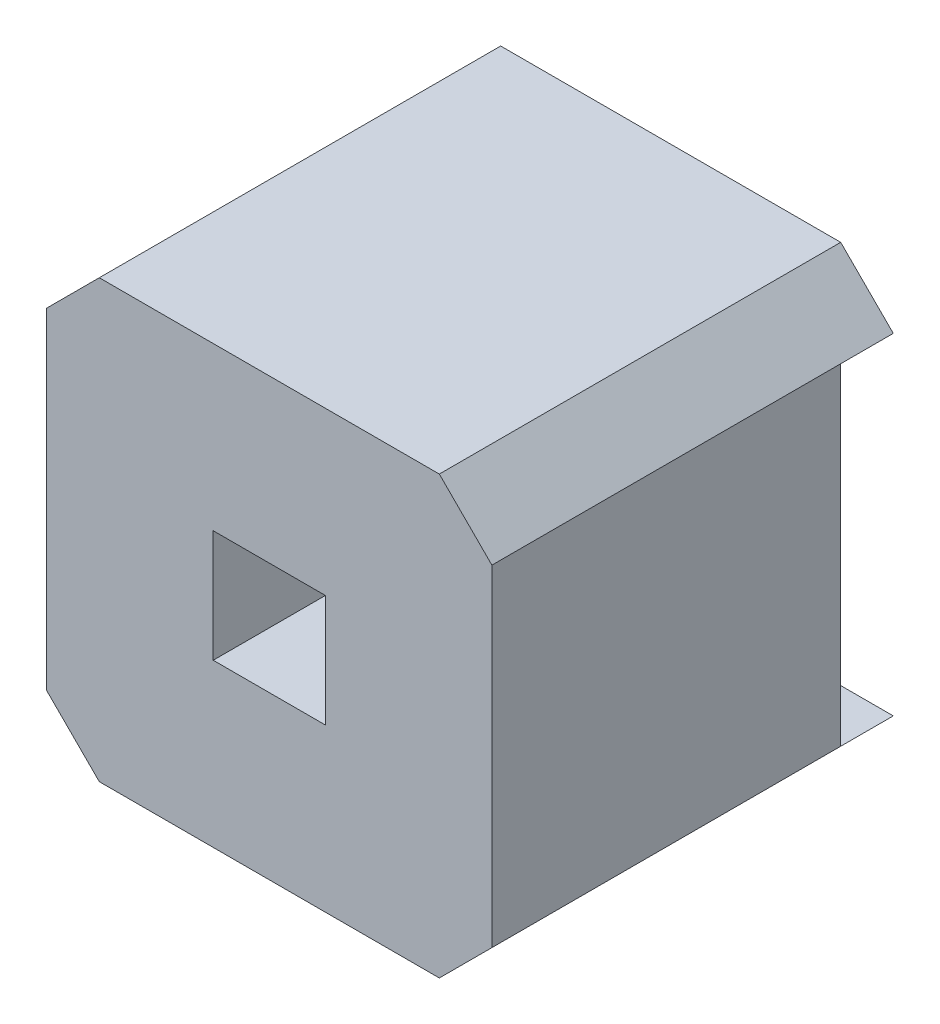
ISO-10303-21;
HEADER;
FILE_DESCRIPTION(('STEP AP214'),'2;1');
FILE_NAME('part.step','',(''),(''),'','','');
FILE_SCHEMA(('AUTOMOTIVE_DESIGN { 1 0 10303 214 1 1 1 1 }'));
ENDSEC;
DATA;
#1=APPLICATION_CONTEXT('core data for automotive mechanical design processes');
#2=APPLICATION_PROTOCOL_DEFINITION('international standard','automotive_design',2000,#1);
#3=PRODUCT_CONTEXT('',#1,'mechanical');
#4=PRODUCT('Part','Part','',(#3));
#5=PRODUCT_RELATED_PRODUCT_CATEGORY('part','',(#4));
#6=PRODUCT_DEFINITION_FORMATION('','',#4);
#7=PRODUCT_DEFINITION_CONTEXT('part definition',#1,'design');
#8=PRODUCT_DEFINITION('design','',#6,#7);
#9=PRODUCT_DEFINITION_SHAPE('','',#8);
#10=(LENGTH_UNIT() NAMED_UNIT(*) SI_UNIT(.MILLI.,.METRE.));
#11=(NAMED_UNIT(*) PLANE_ANGLE_UNIT() SI_UNIT($,.RADIAN.));
#12=(NAMED_UNIT(*) SI_UNIT($,.STERADIAN.) SOLID_ANGLE_UNIT());
#13=UNCERTAINTY_MEASURE_WITH_UNIT(LENGTH_MEASURE(1.E-05),#10,'distance_accuracy_value','');
#14=(GEOMETRIC_REPRESENTATION_CONTEXT(3) GLOBAL_UNCERTAINTY_ASSIGNED_CONTEXT((#13)) GLOBAL_UNIT_ASSIGNED_CONTEXT((#10,
#11,#12)) REPRESENTATION_CONTEXT('',''));
#15=CARTESIAN_POINT('',(0.,0.,0.));
#16=DIRECTION('',(0.,0.,1.));
#17=DIRECTION('',(1.,0.,0.));
#18=AXIS2_PLACEMENT_3D('',#15,#16,#17);
#19=CARTESIAN_POINT('',(6.349999885559,1.245,2.289999961853));
#20=DIRECTION('',(0.,0.,1.));
#21=DIRECTION('',(1.,0.,0.));
#22=AXIS2_PLACEMENT_3D('',#19,#20,#21);
#23=PLANE('',#22);
#24=DIRECTION('',(0.,1.,0.));
#25=VECTOR('',#24,1.);
#26=CARTESIAN_POINT('',(7.939999885559,0.32,2.289999961853));
#27=LINE('',#26,#25);
#28=CARTESIAN_POINT('',(7.939999885559,-0.32,2.289999961853));
#29=VERTEX_POINT('',#28);
#30=CARTESIAN_POINT('',(7.939999885559,0.32,2.289999961853));
#31=VERTEX_POINT('',#30);
#32=EDGE_CURVE('E11',#29,#31,#27,.T.);
#33=ORIENTED_EDGE('',*,*,#32,.F.);
#34=DIRECTION('',(-1.,0.,0.));
#35=VECTOR('',#34,1.);
#36=CARTESIAN_POINT('',(6.349999885559,-0.32,2.289999961853));
#37=LINE('',#36,#35);
#38=CARTESIAN_POINT('',(7.299999885559,-0.32,2.289999961853));
#39=VERTEX_POINT('',#38);
#40=EDGE_CURVE('E24',#29,#39,#37,.T.);
#41=ORIENTED_EDGE('',*,*,#40,.T.);
#42=DIRECTION('',(0.,-1.,0.));
#43=VECTOR('',#42,1.);
#44=CARTESIAN_POINT('',(7.299999885559,-0.32,2.289999961853));
#45=LINE('',#44,#43);
#46=CARTESIAN_POINT('',(7.299999885559,0.32,2.289999961853));
#47=VERTEX_POINT('',#46);
#48=EDGE_CURVE('E231',#47,#39,#45,.T.);
#49=ORIENTED_EDGE('',*,*,#48,.F.);
#50=DIRECTION('',(-1.,0.,0.));
#51=VECTOR('',#50,1.);
#52=CARTESIAN_POINT('',(7.299999885559,0.32,2.289999961853));
#53=LINE('',#52,#51);
#54=EDGE_CURVE('E228',#31,#47,#53,.T.);
#55=ORIENTED_EDGE('',*,*,#54,.F.);
#56=EDGE_LOOP('',(#33,#41,#49,#55));
#57=FACE_BOUND('',#56,.T.);
#58=DIRECTION('',(0.,1.,0.));
#59=VECTOR('',#58,1.);
#60=CARTESIAN_POINT('',(8.889999885559,1.245,2.289999961853));
#61=LINE('',#60,#59);
#62=CARTESIAN_POINT('',(8.88999988555925,-0.94499998807925,2.289999961853));
#63=VERTEX_POINT('',#62);
#64=CARTESIAN_POINT('',(8.88999988555925,0.94499998807925,2.289999961853));
#65=VERTEX_POINT('',#64);
#66=EDGE_CURVE('E226',#63,#65,#61,.T.);
#67=ORIENTED_EDGE('',*,*,#66,.T.);
#68=DIRECTION('',(0.707106781186548,-0.707106781186548,0.));
#69=VECTOR('',#68,1.);
#70=CARTESIAN_POINT('',(8.739999879599,1.09499999404,2.289999961853));
#71=LINE('',#70,#69);
#72=CARTESIAN_POINT('',(8.58999987363825,1.24500000000025,2.289999961853));
#73=VERTEX_POINT('',#72);
#74=EDGE_CURVE('E223',#73,#65,#71,.T.);
#75=ORIENTED_EDGE('',*,*,#74,.F.);
#76=DIRECTION('',(-1.,0.,0.));
#77=VECTOR('',#76,1.);
#78=CARTESIAN_POINT('',(6.349999885559,1.245,2.289999961853));
#79=LINE('',#78,#77);
#80=CARTESIAN_POINT('',(6.64999989748,1.245,2.289999961853));
#81=VERTEX_POINT('',#80);
#82=EDGE_CURVE('E221',#73,#81,#79,.T.);
#83=ORIENTED_EDGE('',*,*,#82,.T.);
#84=DIRECTION('',(0.707106781186548,0.707106781186548,0.));
#85=VECTOR('',#84,1.);
#86=CARTESIAN_POINT('',(6.49999989152,1.09499999404,2.289999961853));
#87=LINE('',#86,#85);
#88=CARTESIAN_POINT('',(6.349999885559,0.944999988079,2.289999961853));
#89=VERTEX_POINT('',#88);
#90=EDGE_CURVE('E219',#89,#81,#87,.T.);
#91=ORIENTED_EDGE('',*,*,#90,.F.);
#92=DIRECTION('',(0.,-1.,0.));
#93=VECTOR('',#92,1.);
#94=CARTESIAN_POINT('',(6.349999885559,1.245,2.289999961853));
#95=LINE('',#94,#93);
#96=CARTESIAN_POINT('',(6.349999885559,-0.944999988079,2.289999961853));
#97=VERTEX_POINT('',#96);
#98=EDGE_CURVE('E217',#89,#97,#95,.T.);
#99=ORIENTED_EDGE('',*,*,#98,.T.);
#100=DIRECTION('',(-0.707106781186548,0.707106781186548,0.));
#101=VECTOR('',#100,1.);
#102=CARTESIAN_POINT('',(6.49999989152,-1.09499999404,2.289999961853));
#103=LINE('',#102,#101);
#104=CARTESIAN_POINT('',(6.64999989748,-1.245,2.289999961853));
#105=VERTEX_POINT('',#104);
#106=EDGE_CURVE('E214',#105,#97,#103,.T.);
#107=ORIENTED_EDGE('',*,*,#106,.F.);
#108=DIRECTION('',(1.,0.,0.));
#109=VECTOR('',#108,1.);
#110=CARTESIAN_POINT('',(6.349999885559,-1.245,2.289999961853));
#111=LINE('',#110,#109);
#112=CARTESIAN_POINT('',(8.58999987363825,-1.24500000000025,2.289999961853));
#113=VERTEX_POINT('',#112);
#114=EDGE_CURVE('E212',#105,#113,#111,.T.);
#115=ORIENTED_EDGE('',*,*,#114,.T.);
#116=DIRECTION('',(-0.707106781186548,-0.707106781186548,0.));
#117=VECTOR('',#116,1.);
#118=CARTESIAN_POINT('',(8.739999879599,-1.09499999404,2.289999961853));
#119=LINE('',#118,#117);
#120=EDGE_CURVE('E209',#63,#113,#119,.T.);
#121=ORIENTED_EDGE('',*,*,#120,.F.);
#122=EDGE_LOOP('',(#67,#75,#83,#91,#99,#107,#115,#121));
#123=FACE_BOUND('',#122,.T.);
#124=ADVANCED_FACE('F17',(#57,#123),#23,.T.);
#125=CARTESIAN_POINT('',(7.939999885559,-0.32,2.289999961853));
#126=DIRECTION('',(0.,1.,0.));
#127=DIRECTION('',(0.,0.,1.));
#128=AXIS2_PLACEMENT_3D('',#125,#126,#127);
#129=PLANE('',#128);
#130=DIRECTION('',(0.,0.,1.));
#131=VECTOR('',#130,1.);
#132=CARTESIAN_POINT('',(7.299999885559,-0.32,2.289999961853));
#133=LINE('',#132,#131);
#134=CARTESIAN_POINT('',(7.299999885559,-0.32,0.300000011921));
#135=VERTEX_POINT('',#134);
#136=EDGE_CURVE('E206',#135,#39,#133,.T.);
#137=ORIENTED_EDGE('',*,*,#136,.T.);
#138=ORIENTED_EDGE('',*,*,#40,.F.);
#139=DIRECTION('',(0.,0.,-1.));
#140=VECTOR('',#139,1.);
#141=CARTESIAN_POINT('',(7.939999885559,-0.32,2.289999961853));
#142=LINE('',#141,#140);
#143=CARTESIAN_POINT('',(7.939999885559,-0.32,0.300000011921));
#144=VERTEX_POINT('',#143);
#145=EDGE_CURVE('E204',#29,#144,#142,.T.);
#146=ORIENTED_EDGE('',*,*,#145,.T.);
#147=DIRECTION('',(-1.,0.,0.));
#148=VECTOR('',#147,1.);
#149=CARTESIAN_POINT('',(7.939999885559,-0.32,0.300000011921));
#150=LINE('',#149,#148);
#151=EDGE_CURVE('E201',#144,#135,#150,.T.);
#152=ORIENTED_EDGE('',*,*,#151,.T.);
#153=EDGE_LOOP('',(#137,#138,#146,#152));
#154=FACE_BOUND('',#153,.T.);
#155=ADVANCED_FACE('F237',(#154),#129,.T.);
#156=CARTESIAN_POINT('',(8.889999885559,1.245,0.));
#157=DIRECTION('',(1.,0.,0.));
#158=DIRECTION('',(0.,0.,-1.));
#159=AXIS2_PLACEMENT_3D('',#156,#157,#158);
#160=PLANE('',#159);
#161=ORIENTED_EDGE('',*,*,#66,.F.);
#162=DIRECTION('',(0.,0.,-1.));
#163=VECTOR('',#162,1.);
#164=CARTESIAN_POINT('',(8.889999885559,-0.944999988079,0.));
#165=LINE('',#164,#163);
#166=CARTESIAN_POINT('',(8.88999988555906,-0.944999988079063,0.300000011921));
#167=VERTEX_POINT('',#166);
#168=EDGE_CURVE('E199',#63,#167,#165,.T.);
#169=ORIENTED_EDGE('',*,*,#168,.T.);
#170=DIRECTION('',(0.,1.,0.));
#171=VECTOR('',#170,1.);
#172=CARTESIAN_POINT('',(8.889999885559,1.245,0.300000011921));
#173=LINE('',#172,#171);
#174=CARTESIAN_POINT('',(8.88999988555906,0.944999988079063,0.300000011921));
#175=VERTEX_POINT('',#174);
#176=EDGE_CURVE('E197',#167,#175,#173,.T.);
#177=ORIENTED_EDGE('',*,*,#176,.T.);
#178=DIRECTION('',(0.,0.,1.));
#179=VECTOR('',#178,1.);
#180=CARTESIAN_POINT('',(8.889999885559,0.944999988079,0.));
#181=LINE('',#180,#179);
#182=EDGE_CURVE('E194',#175,#65,#181,.T.);
#183=ORIENTED_EDGE('',*,*,#182,.T.);
#184=EDGE_LOOP('',(#161,#169,#177,#183));
#185=FACE_BOUND('',#184,.T.);
#186=ADVANCED_FACE('F265',(#185),#160,.T.);
#187=CARTESIAN_POINT('',(8.889999885559,-1.245,0.));
#188=DIRECTION('',(0.,-1.,0.));
#189=DIRECTION('',(0.,0.,-1.));
#190=AXIS2_PLACEMENT_3D('',#187,#188,#189);
#191=PLANE('',#190);
#192=ORIENTED_EDGE('',*,*,#114,.F.);
#193=DIRECTION('',(0.,0.,-1.));
#194=VECTOR('',#193,1.);
#195=CARTESIAN_POINT('',(6.64999989748,-1.245,0.));
#196=LINE('',#195,#194);
#197=CARTESIAN_POINT('',(6.64999989748,-1.245,0.));
#198=VERTEX_POINT('',#197);
#199=EDGE_CURVE('E192',#105,#198,#196,.T.);
#200=ORIENTED_EDGE('',*,*,#199,.T.);
#201=DIRECTION('',(1.,0.,0.));
#202=VECTOR('',#201,1.);
#203=CARTESIAN_POINT('',(8.889999885559,-1.245,0.));
#204=LINE('',#203,#202);
#205=CARTESIAN_POINT('',(8.58999987363812,-1.24500000000012,0.));
#206=VERTEX_POINT('',#205);
#207=EDGE_CURVE('E190',#198,#206,#204,.T.);
#208=ORIENTED_EDGE('',*,*,#207,.T.);
#209=DIRECTION('',(0.,0.,1.));
#210=VECTOR('',#209,1.);
#211=CARTESIAN_POINT('',(8.589999873638,-1.245,0.));
#212=LINE('',#211,#210);
#213=EDGE_CURVE('E187',#206,#113,#212,.T.);
#214=ORIENTED_EDGE('',*,*,#213,.T.);
#215=EDGE_LOOP('',(#192,#200,#208,#214));
#216=FACE_BOUND('',#215,.T.);
#217=ADVANCED_FACE('F269',(#216),#191,.T.);
#218=CARTESIAN_POINT('',(6.349999885559,-1.245,0.));
#219=DIRECTION('',(-1.,0.,0.));
#220=DIRECTION('',(0.,0.,1.));
#221=AXIS2_PLACEMENT_3D('',#218,#219,#220);
#222=PLANE('',#221);
#223=ORIENTED_EDGE('',*,*,#98,.F.);
#224=DIRECTION('',(0.,0.,-1.));
#225=VECTOR('',#224,1.);
#226=CARTESIAN_POINT('',(6.349999885559,0.944999988079,0.));
#227=LINE('',#226,#225);
#228=CARTESIAN_POINT('',(6.349999885559,0.944999988079,0.300000011921));
#229=VERTEX_POINT('',#228);
#230=EDGE_CURVE('E185',#89,#229,#227,.T.);
#231=ORIENTED_EDGE('',*,*,#230,.T.);
#232=DIRECTION('',(0.,-1.,0.));
#233=VECTOR('',#232,1.);
#234=CARTESIAN_POINT('',(6.349999885559,-1.245,0.300000011921));
#235=LINE('',#234,#233);
#236=CARTESIAN_POINT('',(6.349999885559,-0.944999988079,0.300000011921));
#237=VERTEX_POINT('',#236);
#238=EDGE_CURVE('E183',#229,#237,#235,.T.);
#239=ORIENTED_EDGE('',*,*,#238,.T.);
#240=DIRECTION('',(0.,0.,1.));
#241=VECTOR('',#240,1.);
#242=CARTESIAN_POINT('',(6.349999885559,-0.944999988079,0.));
#243=LINE('',#242,#241);
#244=EDGE_CURVE('E180',#237,#97,#243,.T.);
#245=ORIENTED_EDGE('',*,*,#244,.T.);
#246=EDGE_LOOP('',(#223,#231,#239,#245));
#247=FACE_BOUND('',#246,.T.);
#248=ADVANCED_FACE('F275',(#247),#222,.T.);
#249=CARTESIAN_POINT('',(6.349999885559,1.245,0.));
#250=DIRECTION('',(0.,1.,0.));
#251=DIRECTION('',(0.,0.,1.));
#252=AXIS2_PLACEMENT_3D('',#249,#250,#251);
#253=PLANE('',#252);
#254=ORIENTED_EDGE('',*,*,#82,.F.);
#255=DIRECTION('',(0.,0.,-1.));
#256=VECTOR('',#255,1.);
#257=CARTESIAN_POINT('',(8.589999873638,1.245,0.));
#258=LINE('',#257,#256);
#259=CARTESIAN_POINT('',(8.58999987363812,1.24500000000012,0.));
#260=VERTEX_POINT('',#259);
#261=EDGE_CURVE('E178',#73,#260,#258,.T.);
#262=ORIENTED_EDGE('',*,*,#261,.T.);
#263=DIRECTION('',(-1.,0.,0.));
#264=VECTOR('',#263,1.);
#265=CARTESIAN_POINT('',(6.349999885559,1.245,0.));
#266=LINE('',#265,#264);
#267=CARTESIAN_POINT('',(6.64999989748,1.245,0.));
#268=VERTEX_POINT('',#267);
#269=EDGE_CURVE('E176',#260,#268,#266,.T.);
#270=ORIENTED_EDGE('',*,*,#269,.T.);
#271=DIRECTION('',(0.,0.,1.));
#272=VECTOR('',#271,1.);
#273=CARTESIAN_POINT('',(6.64999989748,1.245,0.));
#274=LINE('',#273,#272);
#275=EDGE_CURVE('E122',#268,#81,#274,.T.);
#276=ORIENTED_EDGE('',*,*,#275,.T.);
#277=EDGE_LOOP('',(#254,#262,#270,#276));
#278=FACE_BOUND('',#277,.T.);
#279=ADVANCED_FACE('F279',(#278),#253,.T.);
#280=CARTESIAN_POINT('',(7.299999885559,-0.32,2.289999961853));
#281=DIRECTION('',(1.,0.,0.));
#282=DIRECTION('',(0.,0.,-1.));
#283=AXIS2_PLACEMENT_3D('',#280,#281,#282);
#284=PLANE('',#283);
#285=DIRECTION('',(0.,0.,1.));
#286=VECTOR('',#285,1.);
#287=CARTESIAN_POINT('',(7.299999885559,0.32,2.289999961853));
#288=LINE('',#287,#286);
#289=CARTESIAN_POINT('',(7.299999885559,0.32,0.300000011921));
#290=VERTEX_POINT('',#289);
#291=EDGE_CURVE('E172',#290,#47,#288,.T.);
#292=ORIENTED_EDGE('',*,*,#291,.T.);
#293=ORIENTED_EDGE('',*,*,#48,.T.);
#294=ORIENTED_EDGE('',*,*,#136,.F.);
#295=DIRECTION('',(0.,1.,0.));
#296=VECTOR('',#295,1.);
#297=CARTESIAN_POINT('',(7.299999885559,-0.32,0.300000011921));
#298=LINE('',#297,#296);
#299=EDGE_CURVE('E169',#135,#290,#298,.T.);
#300=ORIENTED_EDGE('',*,*,#299,.T.);
#301=EDGE_LOOP('',(#292,#293,#294,#300));
#302=FACE_BOUND('',#301,.T.);
#303=ADVANCED_FACE('F236',(#302),#284,.T.);
#304=CARTESIAN_POINT('',(6.349999885559,-0.944999988079,0.300000011921));
#305=DIRECTION('',(0.,0.,-1.));
#306=DIRECTION('',(-1.,0.,0.));
#307=AXIS2_PLACEMENT_3D('',#304,#305,#306);
#308=PLANE('',#307);
#309=DIRECTION('',(1.,0.,0.));
#310=VECTOR('',#309,1.);
#311=CARTESIAN_POINT('',(6.349999885559,0.944999988079,0.300000011921));
#312=LINE('',#311,#310);
#313=EDGE_CURVE('E135',#229,#175,#312,.T.);
#314=ORIENTED_EDGE('',*,*,#313,.T.);
#315=ORIENTED_EDGE('',*,*,#176,.F.);
#316=DIRECTION('',(-1.,0.,0.));
#317=VECTOR('',#316,1.);
#318=CARTESIAN_POINT('',(6.349999885559,-0.944999988079,0.300000011921));
#319=LINE('',#318,#317);
#320=EDGE_CURVE('E165',#167,#237,#319,.T.);
#321=ORIENTED_EDGE('',*,*,#320,.T.);
#322=ORIENTED_EDGE('',*,*,#238,.F.);
#323=EDGE_LOOP('',(#314,#315,#321,#322));
#324=FACE_BOUND('',#323,.T.);
#325=DIRECTION('',(0.,1.,0.));
#326=VECTOR('',#325,1.);
#327=CARTESIAN_POINT('',(7.939999885559,-0.944999988079,0.300000011921));
#328=LINE('',#327,#326);
#329=CARTESIAN_POINT('',(7.939999885559,0.32,0.300000011921));
#330=VERTEX_POINT('',#329);
#331=EDGE_CURVE('E163',#144,#330,#328,.T.);
#332=ORIENTED_EDGE('',*,*,#331,.T.);
#333=DIRECTION('',(-1.,0.,0.));
#334=VECTOR('',#333,1.);
#335=CARTESIAN_POINT('',(6.349999885559,0.32,0.300000011921));
#336=LINE('',#335,#334);
#337=EDGE_CURVE('E160',#330,#290,#336,.T.);
#338=ORIENTED_EDGE('',*,*,#337,.T.);
#339=ORIENTED_EDGE('',*,*,#299,.F.);
#340=ORIENTED_EDGE('',*,*,#151,.F.);
#341=EDGE_LOOP('',(#332,#338,#339,#340));
#342=FACE_BOUND('',#341,.T.);
#343=ADVANCED_FACE('F242',(#324,#342),#308,.T.);
#344=CARTESIAN_POINT('',(7.939999885559,0.32,2.289999961853));
#345=DIRECTION('',(-1.,0.,0.));
#346=DIRECTION('',(0.,0.,1.));
#347=AXIS2_PLACEMENT_3D('',#344,#345,#346);
#348=PLANE('',#347);
#349=ORIENTED_EDGE('',*,*,#145,.F.);
#350=ORIENTED_EDGE('',*,*,#32,.T.);
#351=DIRECTION('',(0.,0.,-1.));
#352=VECTOR('',#351,1.);
#353=CARTESIAN_POINT('',(7.939999885559,0.32,2.289999961853));
#354=LINE('',#353,#352);
#355=EDGE_CURVE('E158',#31,#330,#354,.T.);
#356=ORIENTED_EDGE('',*,*,#355,.T.);
#357=ORIENTED_EDGE('',*,*,#331,.F.);
#358=EDGE_LOOP('',(#349,#350,#356,#357));
#359=FACE_BOUND('',#358,.T.);
#360=ADVANCED_FACE('F247',(#359),#348,.T.);
#361=CARTESIAN_POINT('',(8.739999879599,-1.09499999404,0.));
#362=DIRECTION('',(0.707106781186548,-0.707106781186548,0.));
#363=DIRECTION('',(0.707106781186548,0.707106781186548,0.));
#364=AXIS2_PLACEMENT_3D('',#361,#362,#363);
#365=PLANE('',#364);
#366=ORIENTED_EDGE('',*,*,#120,.T.);
#367=ORIENTED_EDGE('',*,*,#213,.F.);
#368=DIRECTION('',(0.707106781186548,0.707106781186548,0.));
#369=VECTOR('',#368,1.);
#370=CARTESIAN_POINT('',(8.739999879599,-1.09499999404,0.));
#371=LINE('',#370,#369);
#372=CARTESIAN_POINT('',(8.88999988555913,-0.944999988079125,0.));
#373=VERTEX_POINT('',#372);
#374=EDGE_CURVE('E156',#206,#373,#371,.T.);
#375=ORIENTED_EDGE('',*,*,#374,.T.);
#376=DIRECTION('',(0.,0.,1.));
#377=VECTOR('',#376,1.);
#378=CARTESIAN_POINT('',(8.8899998855595,-0.9449999880795,0.));
#379=LINE('',#378,#377);
#380=EDGE_CURVE('E153',#373,#167,#379,.T.);
#381=ORIENTED_EDGE('',*,*,#380,.T.);
#382=ORIENTED_EDGE('',*,*,#168,.F.);
#383=EDGE_LOOP('',(#366,#367,#375,#381,#382));
#384=FACE_BOUND('',#383,.T.);
#385=ADVANCED_FACE('F249',(#384),#365,.T.);
#386=CARTESIAN_POINT('',(8.739999879599,1.09499999404,0.));
#387=DIRECTION('',(0.707106781186548,0.707106781186548,0.));
#388=DIRECTION('',(-0.707106781186548,0.707106781186548,0.));
#389=AXIS2_PLACEMENT_3D('',#386,#387,#388);
#390=PLANE('',#389);
#391=ORIENTED_EDGE('',*,*,#182,.F.);
#392=DIRECTION('',(0.,0.,-1.));
#393=VECTOR('',#392,1.);
#394=CARTESIAN_POINT('',(8.8899998855595,0.9449999880795,0.));
#395=LINE('',#394,#393);
#396=CARTESIAN_POINT('',(8.88999988555913,0.944999988079125,0.));
#397=VERTEX_POINT('',#396);
#398=EDGE_CURVE('E151',#175,#397,#395,.T.);
#399=ORIENTED_EDGE('',*,*,#398,.T.);
#400=DIRECTION('',(-0.707106781186548,0.707106781186548,0.));
#401=VECTOR('',#400,1.);
#402=CARTESIAN_POINT('',(8.739999879599,1.09499999404,0.));
#403=LINE('',#402,#401);
#404=EDGE_CURVE('E140',#397,#260,#403,.T.);
#405=ORIENTED_EDGE('',*,*,#404,.T.);
#406=ORIENTED_EDGE('',*,*,#261,.F.);
#407=ORIENTED_EDGE('',*,*,#74,.T.);
#408=EDGE_LOOP('',(#391,#399,#405,#406,#407));
#409=FACE_BOUND('',#408,.T.);
#410=ADVANCED_FACE('F256',(#409),#390,.T.);
#411=CARTESIAN_POINT('',(6.49999989152,-1.09499999404,0.));
#412=DIRECTION('',(-0.707106781186548,-0.707106781186548,0.));
#413=DIRECTION('',(0.707106781186548,-0.707106781186548,0.));
#414=AXIS2_PLACEMENT_3D('',#411,#412,#413);
#415=PLANE('',#414);
#416=DIRECTION('',(0.,0.,-1.));
#417=VECTOR('',#416,1.);
#418=CARTESIAN_POINT('',(6.349999885559,-0.944999988078999,0.));
#419=LINE('',#418,#417);
#420=CARTESIAN_POINT('',(6.349999885559,-0.944999988079,0.));
#421=VERTEX_POINT('',#420);
#422=EDGE_CURVE('E148',#237,#421,#419,.T.);
#423=ORIENTED_EDGE('',*,*,#422,.T.);
#424=DIRECTION('',(0.707106781186548,-0.707106781186548,0.));
#425=VECTOR('',#424,1.);
#426=CARTESIAN_POINT('',(6.49999989152,-1.09499999404,0.));
#427=LINE('',#426,#425);
#428=EDGE_CURVE('E145',#421,#198,#427,.T.);
#429=ORIENTED_EDGE('',*,*,#428,.T.);
#430=ORIENTED_EDGE('',*,*,#199,.F.);
#431=ORIENTED_EDGE('',*,*,#106,.T.);
#432=ORIENTED_EDGE('',*,*,#244,.F.);
#433=EDGE_LOOP('',(#423,#429,#430,#431,#432));
#434=FACE_BOUND('',#433,.T.);
#435=ADVANCED_FACE('F320',(#434),#415,.T.);
#436=CARTESIAN_POINT('',(6.349999885559,1.245,0.));
#437=DIRECTION('',(0.,0.,1.));
#438=DIRECTION('',(1.,0.,0.));
#439=AXIS2_PLACEMENT_3D('',#436,#437,#438);
#440=PLANE('',#439);
#441=ORIENTED_EDGE('',*,*,#207,.F.);
#442=ORIENTED_EDGE('',*,*,#428,.F.);
#443=DIRECTION('',(-1.,0.,0.));
#444=VECTOR('',#443,1.);
#445=CARTESIAN_POINT('',(6.349999885559,-0.944999988079,0.));
#446=LINE('',#445,#444);
#447=EDGE_CURVE('E126',#373,#421,#446,.T.);
#448=ORIENTED_EDGE('',*,*,#447,.F.);
#449=ORIENTED_EDGE('',*,*,#374,.F.);
#450=EDGE_LOOP('',(#441,#442,#448,#449));
#451=FACE_BOUND('',#450,.T.);
#452=ADVANCED_FACE('F330',(#451),#440,.F.);
#453=CARTESIAN_POINT('',(6.49999989152,1.09499999404,0.));
#454=DIRECTION('',(-0.707106781186548,0.707106781186548,0.));
#455=DIRECTION('',(-0.707106781186548,-0.707106781186548,0.));
#456=AXIS2_PLACEMENT_3D('',#453,#454,#455);
#457=PLANE('',#456);
#458=ORIENTED_EDGE('',*,*,#275,.F.);
#459=DIRECTION('',(-0.707106781186548,-0.707106781186548,0.));
#460=VECTOR('',#459,1.);
#461=CARTESIAN_POINT('',(6.49999989152,1.09499999404,0.));
#462=LINE('',#461,#460);
#463=CARTESIAN_POINT('',(6.349999885559,0.944999988079,0.));
#464=VERTEX_POINT('',#463);
#465=EDGE_CURVE('E115',#268,#464,#462,.T.);
#466=ORIENTED_EDGE('',*,*,#465,.T.);
#467=DIRECTION('',(0.,0.,1.));
#468=VECTOR('',#467,1.);
#469=CARTESIAN_POINT('',(6.349999885559,0.944999988078999,0.));
#470=LINE('',#469,#468);
#471=EDGE_CURVE('E119',#464,#229,#470,.T.);
#472=ORIENTED_EDGE('',*,*,#471,.T.);
#473=ORIENTED_EDGE('',*,*,#230,.F.);
#474=ORIENTED_EDGE('',*,*,#90,.T.);
#475=EDGE_LOOP('',(#458,#466,#472,#473,#474));
#476=FACE_BOUND('',#475,.T.);
#477=ADVANCED_FACE('F117',(#476),#457,.T.);
#478=CARTESIAN_POINT('',(6.349999885559,1.245,0.));
#479=DIRECTION('',(0.,0.,1.));
#480=DIRECTION('',(1.,0.,0.));
#481=AXIS2_PLACEMENT_3D('',#478,#479,#480);
#482=PLANE('',#481);
#483=DIRECTION('',(1.,0.,0.));
#484=VECTOR('',#483,1.);
#485=CARTESIAN_POINT('',(6.349999885559,0.944999988079,0.));
#486=LINE('',#485,#484);
#487=EDGE_CURVE('E133',#464,#397,#486,.T.);
#488=ORIENTED_EDGE('',*,*,#487,.F.);
#489=ORIENTED_EDGE('',*,*,#465,.F.);
#490=ORIENTED_EDGE('',*,*,#269,.F.);
#491=ORIENTED_EDGE('',*,*,#404,.F.);
#492=EDGE_LOOP('',(#488,#489,#490,#491));
#493=FACE_BOUND('',#492,.T.);
#494=ADVANCED_FACE('F138',(#493),#482,.F.);
#495=CARTESIAN_POINT('',(7.299999885559,0.32,2.289999961853));
#496=DIRECTION('',(0.,-1.,0.));
#497=DIRECTION('',(0.,0.,-1.));
#498=AXIS2_PLACEMENT_3D('',#495,#496,#497);
#499=PLANE('',#498);
#500=ORIENTED_EDGE('',*,*,#355,.F.);
#501=ORIENTED_EDGE('',*,*,#54,.T.);
#502=ORIENTED_EDGE('',*,*,#291,.F.);
#503=ORIENTED_EDGE('',*,*,#337,.F.);
#504=EDGE_LOOP('',(#500,#501,#502,#503));
#505=FACE_BOUND('',#504,.T.);
#506=ADVANCED_FACE('F246',(#505),#499,.T.);
#507=CARTESIAN_POINT('',(8.889999885559,0.944999988079,0.));
#508=DIRECTION('',(0.,-1.,0.));
#509=DIRECTION('',(0.,0.,-1.));
#510=AXIS2_PLACEMENT_3D('',#507,#508,#509);
#511=PLANE('',#510);
#512=ORIENTED_EDGE('',*,*,#471,.F.);
#513=ORIENTED_EDGE('',*,*,#487,.T.);
#514=ORIENTED_EDGE('',*,*,#398,.F.);
#515=ORIENTED_EDGE('',*,*,#313,.F.);
#516=EDGE_LOOP('',(#512,#513,#514,#515));
#517=FACE_BOUND('',#516,.T.);
#518=ADVANCED_FACE('F131',(#517),#511,.T.);
#519=CARTESIAN_POINT('',(6.349999885559,-0.944999988079,0.));
#520=DIRECTION('',(0.,1.,0.));
#521=DIRECTION('',(0.,0.,1.));
#522=AXIS2_PLACEMENT_3D('',#519,#520,#521);
#523=PLANE('',#522);
#524=ORIENTED_EDGE('',*,*,#380,.F.);
#525=ORIENTED_EDGE('',*,*,#447,.T.);
#526=ORIENTED_EDGE('',*,*,#422,.F.);
#527=ORIENTED_EDGE('',*,*,#320,.F.);
#528=EDGE_LOOP('',(#524,#525,#526,#527));
#529=FACE_BOUND('',#528,.T.);
#530=ADVANCED_FACE('F373',(#529),#523,.T.);
#531=CLOSED_SHELL('',(#124,#155,#186,#217,#248,#279,#303,#343,#360,#385,#410,#435,#452,#477,
#494,#506,#518,#530));
#532=MANIFOLD_SOLID_BREP('B1',#531);
#533=ADVANCED_BREP_SHAPE_REPRESENTATION('',(#18,#532),#14);
#534=SHAPE_DEFINITION_REPRESENTATION(#9,#533);
ENDSEC;
END-ISO-10303-21;
